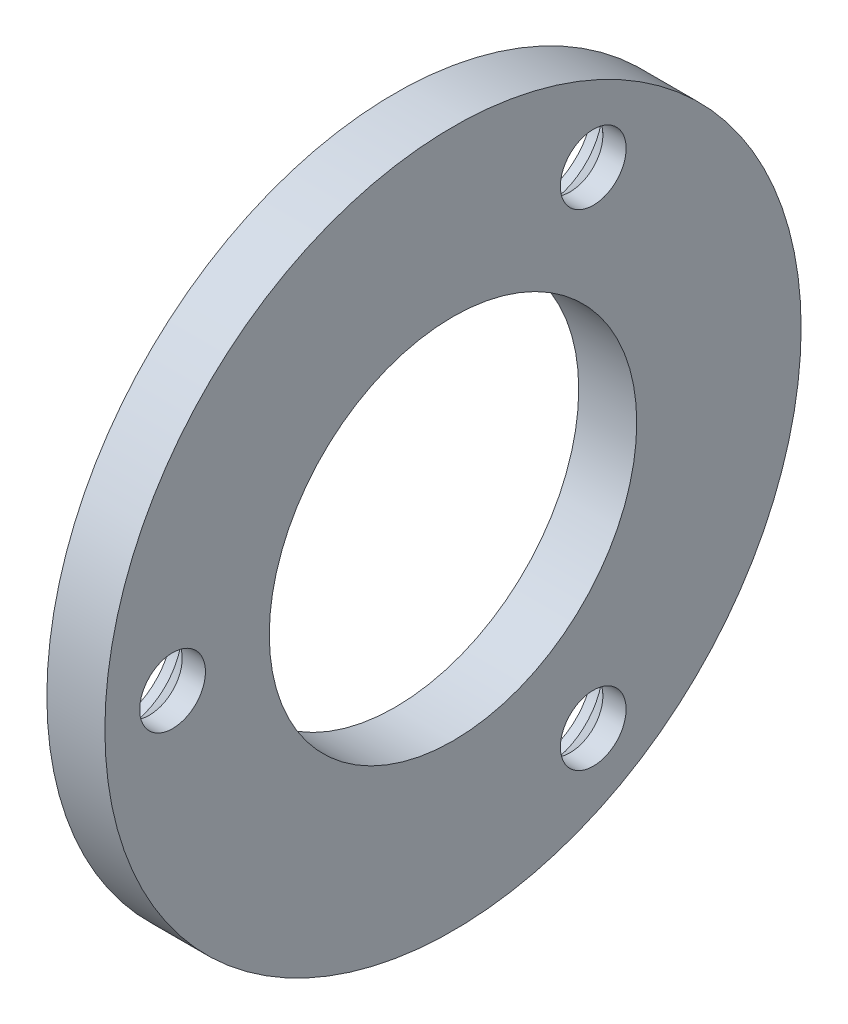
ISO-10303-21;
HEADER;
FILE_DESCRIPTION(('STEP AP214'),'2;1');
FILE_NAME('part.step','',(''),(''),'','','');
FILE_SCHEMA(('AUTOMOTIVE_DESIGN { 1 0 10303 214 1 1 1 1 }'));
ENDSEC;
DATA;
#1=APPLICATION_CONTEXT('core data for automotive mechanical design processes');
#2=APPLICATION_PROTOCOL_DEFINITION('international standard','automotive_design',2000,#1);
#3=PRODUCT_CONTEXT('',#1,'mechanical');
#4=PRODUCT('Part','Part','',(#3));
#5=PRODUCT_RELATED_PRODUCT_CATEGORY('part','',(#4));
#6=PRODUCT_DEFINITION_FORMATION('','',#4);
#7=PRODUCT_DEFINITION_CONTEXT('part definition',#1,'design');
#8=PRODUCT_DEFINITION('design','',#6,#7);
#9=PRODUCT_DEFINITION_SHAPE('','',#8);
#10=(LENGTH_UNIT() NAMED_UNIT(*) SI_UNIT(.MILLI.,.METRE.));
#11=(NAMED_UNIT(*) PLANE_ANGLE_UNIT() SI_UNIT($,.RADIAN.));
#12=(NAMED_UNIT(*) SI_UNIT($,.STERADIAN.) SOLID_ANGLE_UNIT());
#13=UNCERTAINTY_MEASURE_WITH_UNIT(LENGTH_MEASURE(1.E-05),#10,'distance_accuracy_value','');
#14=(GEOMETRIC_REPRESENTATION_CONTEXT(3) GLOBAL_UNCERTAINTY_ASSIGNED_CONTEXT((#13)) GLOBAL_UNIT_ASSIGNED_CONTEXT((#10,
#11,#12)) REPRESENTATION_CONTEXT('',''));
#15=CARTESIAN_POINT('',(0.,0.,0.));
#16=DIRECTION('',(0.,0.,1.));
#17=DIRECTION('',(1.,0.,0.));
#18=AXIS2_PLACEMENT_3D('',#15,#16,#17);
#19=CARTESIAN_POINT('',(43.2,93.157368354874,-7.25));
#20=DIRECTION('',(-1.,0.,0.));
#21=DIRECTION('',(0.,0.,1.));
#22=AXIS2_PLACEMENT_3D('',#19,#20,#21);
#23=CONICAL_SURFACE('',#22,3.,0.785398163397);
#24=CARTESIAN_POINT('',(44.5,93.157368354874,-7.25));
#25=DIRECTION('',(1.,0.,0.));
#26=DIRECTION('',(0.,0.,1.));
#27=AXIS2_PLACEMENT_3D('',#24,#25,#26);
#28=CIRCLE('',#27,1.7);
#29=CARTESIAN_POINT('',(44.5,93.157368354874,-8.95));
#30=VERTEX_POINT('',#29);
#31=CARTESIAN_POINT('',(44.5,93.157368354874,-5.55));
#32=VERTEX_POINT('',#31);
#33=EDGE_CURVE('E175',#30,#32,#28,.T.);
#34=ORIENTED_EDGE('',*,*,#33,.T.);
#35=DIRECTION('',(0.707106781186548,0.,-0.707106781186548));
#36=VECTOR('',#35,1.);
#37=CARTESIAN_POINT('',(43.2,93.157368354874,-4.25));
#38=LINE('',#37,#36);
#39=CARTESIAN_POINT('',(43.2,93.157368354874,-4.25));
#40=VERTEX_POINT('',#39);
#41=EDGE_CURVE('E9',#40,#32,#38,.T.);
#42=ORIENTED_EDGE('',*,*,#41,.F.);
#43=CARTESIAN_POINT('',(43.2,93.157368354874,-7.25));
#44=DIRECTION('',(1.,0.,0.));
#45=DIRECTION('',(0.,0.,-1.));
#46=AXIS2_PLACEMENT_3D('',#43,#44,#45);
#47=CIRCLE('',#46,3.);
#48=CARTESIAN_POINT('',(43.2,93.157368354874,-10.25));
#49=VERTEX_POINT('',#48);
#50=EDGE_CURVE('E144',#49,#40,#47,.T.);
#51=ORIENTED_EDGE('',*,*,#50,.F.);
#52=CARTESIAN_POINT('',(43.2,93.157368354874,-7.25));
#53=DIRECTION('',(1.,0.,0.));
#54=DIRECTION('',(0.,0.,-1.));
#55=AXIS2_PLACEMENT_3D('',#52,#53,#54);
#56=CIRCLE('',#55,3.);
#57=EDGE_CURVE('E142',#40,#49,#56,.T.);
#58=ORIENTED_EDGE('',*,*,#57,.F.);
#59=ORIENTED_EDGE('',*,*,#41,.T.);
#60=CARTESIAN_POINT('',(44.5,93.157368354874,-7.25));
#61=DIRECTION('',(1.,0.,0.));
#62=DIRECTION('',(0.,0.,1.));
#63=AXIS2_PLACEMENT_3D('',#60,#61,#62);
#64=CIRCLE('',#63,1.7);
#65=EDGE_CURVE('E179',#32,#30,#64,.T.);
#66=ORIENTED_EDGE('',*,*,#65,.T.);
#67=EDGE_LOOP('',(#34,#42,#51,#58,#59,#66));
#68=FACE_BOUND('',#67,.T.);
#69=ADVANCED_FACE('F14',(#68),#23,.F.);
#70=CARTESIAN_POINT('',(43.2,80.6,14.5));
#71=DIRECTION('',(-1.,0.,0.));
#72=DIRECTION('',(0.,0.,1.));
#73=AXIS2_PLACEMENT_3D('',#70,#71,#72);
#74=CONICAL_SURFACE('',#73,3.,0.785398163397);
#75=CARTESIAN_POINT('',(44.5,80.6,14.5));
#76=DIRECTION('',(1.,0.,0.));
#77=DIRECTION('',(0.,0.,1.));
#78=AXIS2_PLACEMENT_3D('',#75,#76,#77);
#79=CIRCLE('',#78,1.7);
#80=CARTESIAN_POINT('',(44.5,80.6,12.8));
#81=VERTEX_POINT('',#80);
#82=CARTESIAN_POINT('',(44.5,80.6,16.2));
#83=VERTEX_POINT('',#82);
#84=EDGE_CURVE('E180',#81,#83,#79,.T.);
#85=ORIENTED_EDGE('',*,*,#84,.T.);
#86=DIRECTION('',(0.707106781186548,0.,-0.707106781186548));
#87=VECTOR('',#86,1.);
#88=CARTESIAN_POINT('',(43.2,80.6,17.5));
#89=LINE('',#88,#87);
#90=CARTESIAN_POINT('',(43.2,80.6,17.5));
#91=VERTEX_POINT('',#90);
#92=EDGE_CURVE('E25',#91,#83,#89,.T.);
#93=ORIENTED_EDGE('',*,*,#92,.F.);
#94=CARTESIAN_POINT('',(43.2,80.6,14.5));
#95=DIRECTION('',(1.,0.,0.));
#96=DIRECTION('',(0.,0.,-1.));
#97=AXIS2_PLACEMENT_3D('',#94,#95,#96);
#98=CIRCLE('',#97,3.);
#99=CARTESIAN_POINT('',(43.2,80.6,11.5));
#100=VERTEX_POINT('',#99);
#101=EDGE_CURVE('E190',#100,#91,#98,.T.);
#102=ORIENTED_EDGE('',*,*,#101,.F.);
#103=CARTESIAN_POINT('',(43.2,80.6,14.5));
#104=DIRECTION('',(1.,0.,0.));
#105=DIRECTION('',(0.,0.,-1.));
#106=AXIS2_PLACEMENT_3D('',#103,#104,#105);
#107=CIRCLE('',#106,3.);
#108=EDGE_CURVE('E194',#91,#100,#107,.T.);
#109=ORIENTED_EDGE('',*,*,#108,.F.);
#110=ORIENTED_EDGE('',*,*,#92,.T.);
#111=CARTESIAN_POINT('',(44.5,80.6,14.5));
#112=DIRECTION('',(1.,0.,0.));
#113=DIRECTION('',(0.,0.,1.));
#114=AXIS2_PLACEMENT_3D('',#111,#112,#113);
#115=CIRCLE('',#114,1.7);
#116=EDGE_CURVE('E169',#83,#81,#115,.T.);
#117=ORIENTED_EDGE('',*,*,#116,.T.);
#118=EDGE_LOOP('',(#85,#93,#102,#109,#110,#117));
#119=FACE_BOUND('',#118,.T.);
#120=ADVANCED_FACE('F262',(#119),#74,.F.);
#121=CARTESIAN_POINT('',(43.2,68.042631645126,-7.25));
#122=DIRECTION('',(-1.,0.,0.));
#123=DIRECTION('',(0.,0.,1.));
#124=AXIS2_PLACEMENT_3D('',#121,#122,#123);
#125=CONICAL_SURFACE('',#124,3.,0.785398163397);
#126=CARTESIAN_POINT('',(44.5,68.042631645126,-7.25));
#127=DIRECTION('',(1.,0.,0.));
#128=DIRECTION('',(0.,0.,1.));
#129=AXIS2_PLACEMENT_3D('',#126,#127,#128);
#130=CIRCLE('',#129,1.7);
#131=CARTESIAN_POINT('',(44.5,68.042631645126,-8.95));
#132=VERTEX_POINT('',#131);
#133=CARTESIAN_POINT('',(44.5,68.042631645126,-5.55));
#134=VERTEX_POINT('',#133);
#135=EDGE_CURVE('E159',#132,#134,#130,.T.);
#136=ORIENTED_EDGE('',*,*,#135,.T.);
#137=DIRECTION('',(0.707106781186548,0.,-0.707106781186548));
#138=VECTOR('',#137,1.);
#139=CARTESIAN_POINT('',(43.2,68.042631645126,-4.25));
#140=LINE('',#139,#138);
#141=CARTESIAN_POINT('',(43.2,68.042631645126,-4.25));
#142=VERTEX_POINT('',#141);
#143=EDGE_CURVE('E170',#142,#134,#140,.T.);
#144=ORIENTED_EDGE('',*,*,#143,.F.);
#145=CARTESIAN_POINT('',(43.2,68.042631645126,-7.25));
#146=DIRECTION('',(1.,0.,0.));
#147=DIRECTION('',(0.,0.,-1.));
#148=AXIS2_PLACEMENT_3D('',#145,#146,#147);
#149=CIRCLE('',#148,3.);
#150=CARTESIAN_POINT('',(43.2,68.042631645126,-10.25));
#151=VERTEX_POINT('',#150);
#152=EDGE_CURVE('E196',#151,#142,#149,.T.);
#153=ORIENTED_EDGE('',*,*,#152,.F.);
#154=CARTESIAN_POINT('',(43.2,68.042631645126,-7.25));
#155=DIRECTION('',(1.,0.,0.));
#156=DIRECTION('',(0.,0.,-1.));
#157=AXIS2_PLACEMENT_3D('',#154,#155,#156);
#158=CIRCLE('',#157,3.);
#159=EDGE_CURVE('E145',#142,#151,#158,.T.);
#160=ORIENTED_EDGE('',*,*,#159,.F.);
#161=ORIENTED_EDGE('',*,*,#143,.T.);
#162=CARTESIAN_POINT('',(44.5,68.042631645126,-7.25));
#163=DIRECTION('',(1.,0.,0.));
#164=DIRECTION('',(0.,0.,1.));
#165=AXIS2_PLACEMENT_3D('',#162,#163,#164);
#166=CIRCLE('',#165,1.7);
#167=EDGE_CURVE('E151',#134,#132,#166,.T.);
#168=ORIENTED_EDGE('',*,*,#167,.T.);
#169=EDGE_LOOP('',(#136,#144,#153,#160,#161,#168));
#170=FACE_BOUND('',#169,.T.);
#171=ADVANCED_FACE('F267',(#170),#125,.F.);
#172=CARTESIAN_POINT('',(42.6,93.157368354874,-7.25));
#173=DIRECTION('',(1.,0.,0.));
#174=DIRECTION('',(0.,0.,-1.));
#175=AXIS2_PLACEMENT_3D('',#172,#173,#174);
#176=CYLINDRICAL_SURFACE('',#175,3.);
#177=DIRECTION('',(1.,0.,0.));
#178=VECTOR('',#177,1.);
#179=CARTESIAN_POINT('',(42.6,93.157368354874,-10.25));
#180=LINE('',#179,#178);
#181=CARTESIAN_POINT('',(42.7,93.157368354874,-10.25));
#182=VERTEX_POINT('',#181);
#183=EDGE_CURVE('E137',#182,#49,#180,.T.);
#184=ORIENTED_EDGE('',*,*,#183,.T.);
#185=ORIENTED_EDGE('',*,*,#50,.T.);
#186=ORIENTED_EDGE('',*,*,#57,.T.);
#187=ORIENTED_EDGE('',*,*,#183,.F.);
#188=CARTESIAN_POINT('',(42.7,93.157368354874,-7.25));
#189=DIRECTION('',(1.,0.,0.));
#190=DIRECTION('',(0.,0.,-1.));
#191=AXIS2_PLACEMENT_3D('',#188,#189,#190);
#192=CIRCLE('',#191,3.);
#193=EDGE_CURVE('E140',#182,#182,#192,.T.);
#194=ORIENTED_EDGE('',*,*,#193,.F.);
#195=EDGE_LOOP('',(#184,#185,#186,#187,#194));
#196=FACE_BOUND('',#195,.T.);
#197=ADVANCED_FACE('F139',(#196),#176,.F.);
#198=CARTESIAN_POINT('',(42.6,68.042631645126,-7.25));
#199=DIRECTION('',(1.,0.,0.));
#200=DIRECTION('',(0.,0.,-1.));
#201=AXIS2_PLACEMENT_3D('',#198,#199,#200);
#202=CYLINDRICAL_SURFACE('',#201,3.);
#203=DIRECTION('',(1.,0.,0.));
#204=VECTOR('',#203,1.);
#205=CARTESIAN_POINT('',(42.6,68.042631645126,-10.25));
#206=LINE('',#205,#204);
#207=CARTESIAN_POINT('',(42.7,68.042631645126,-10.25));
#208=VERTEX_POINT('',#207);
#209=EDGE_CURVE('E200',#208,#151,#206,.T.);
#210=ORIENTED_EDGE('',*,*,#209,.T.);
#211=ORIENTED_EDGE('',*,*,#152,.T.);
#212=ORIENTED_EDGE('',*,*,#159,.T.);
#213=ORIENTED_EDGE('',*,*,#209,.F.);
#214=CARTESIAN_POINT('',(42.7,68.042631645126,-7.25));
#215=DIRECTION('',(1.,0.,0.));
#216=DIRECTION('',(0.,0.,-1.));
#217=AXIS2_PLACEMENT_3D('',#214,#215,#216);
#218=CIRCLE('',#217,3.);
#219=EDGE_CURVE('E163',#208,#208,#218,.T.);
#220=ORIENTED_EDGE('',*,*,#219,.F.);
#221=EDGE_LOOP('',(#210,#211,#212,#213,#220));
#222=FACE_BOUND('',#221,.T.);
#223=ADVANCED_FACE('F16',(#222),#202,.F.);
#224=CARTESIAN_POINT('',(42.6,80.6,14.5));
#225=DIRECTION('',(1.,0.,0.));
#226=DIRECTION('',(0.,0.,-1.));
#227=AXIS2_PLACEMENT_3D('',#224,#225,#226);
#228=CYLINDRICAL_SURFACE('',#227,3.);
#229=DIRECTION('',(1.,0.,0.));
#230=VECTOR('',#229,1.);
#231=CARTESIAN_POINT('',(42.6,80.6,11.5));
#232=LINE('',#231,#230);
#233=CARTESIAN_POINT('',(42.7,80.6,11.5));
#234=VERTEX_POINT('',#233);
#235=EDGE_CURVE('E195',#234,#100,#232,.T.);
#236=ORIENTED_EDGE('',*,*,#235,.T.);
#237=ORIENTED_EDGE('',*,*,#101,.T.);
#238=ORIENTED_EDGE('',*,*,#108,.T.);
#239=ORIENTED_EDGE('',*,*,#235,.F.);
#240=CARTESIAN_POINT('',(42.7,80.6,14.5));
#241=DIRECTION('',(1.,0.,0.));
#242=DIRECTION('',(0.,0.,-1.));
#243=AXIS2_PLACEMENT_3D('',#240,#241,#242);
#244=CIRCLE('',#243,3.);
#245=EDGE_CURVE('E187',#234,#234,#244,.T.);
#246=ORIENTED_EDGE('',*,*,#245,.F.);
#247=EDGE_LOOP('',(#236,#237,#238,#239,#246));
#248=FACE_BOUND('',#247,.T.);
#249=ADVANCED_FACE('F277',(#248),#228,.F.);
#250=CARTESIAN_POINT('',(42.6,93.157368354874,-7.25));
#251=DIRECTION('',(1.,0.,0.));
#252=DIRECTION('',(0.,0.,-1.));
#253=AXIS2_PLACEMENT_3D('',#250,#251,#252);
#254=CYLINDRICAL_SURFACE('',#253,1.7);
#255=ORIENTED_EDGE('',*,*,#65,.F.);
#256=ORIENTED_EDGE('',*,*,#33,.F.);
#257=DIRECTION('',(1.,0.,0.));
#258=VECTOR('',#257,1.);
#259=CARTESIAN_POINT('',(42.6,93.157368354874,-8.95));
#260=LINE('',#259,#258);
#261=CARTESIAN_POINT('',(45.7,93.157368354874,-8.95));
#262=VERTEX_POINT('',#261);
#263=EDGE_CURVE('E178',#30,#262,#260,.T.);
#264=ORIENTED_EDGE('',*,*,#263,.T.);
#265=CARTESIAN_POINT('',(45.7,93.157368354874,-7.25));
#266=DIRECTION('',(1.,0.,0.));
#267=DIRECTION('',(0.,0.,-1.));
#268=AXIS2_PLACEMENT_3D('',#265,#266,#267);
#269=CIRCLE('',#268,1.7);
#270=EDGE_CURVE('E213',#262,#262,#269,.T.);
#271=ORIENTED_EDGE('',*,*,#270,.T.);
#272=ORIENTED_EDGE('',*,*,#263,.F.);
#273=EDGE_LOOP('',(#255,#256,#264,#271,#272));
#274=FACE_BOUND('',#273,.T.);
#275=ADVANCED_FACE('F283',(#274),#254,.F.);
#276=CARTESIAN_POINT('',(41.7,80.6,0.));
#277=DIRECTION('',(1.,0.,0.));
#278=DIRECTION('',(0.,0.,-1.));
#279=AXIS2_PLACEMENT_3D('',#276,#277,#278);
#280=CYLINDRICAL_SURFACE('',#279,9.5);
#281=DIRECTION('',(1.,0.,0.));
#282=VECTOR('',#281,1.);
#283=CARTESIAN_POINT('',(41.7,80.6,-9.5));
#284=LINE('',#283,#282);
#285=CARTESIAN_POINT('',(42.7,80.6,-9.5));
#286=VERTEX_POINT('',#285);
#287=CARTESIAN_POINT('',(45.7,80.6,-9.5));
#288=VERTEX_POINT('',#287);
#289=EDGE_CURVE('E202',#286,#288,#284,.T.);
#290=ORIENTED_EDGE('',*,*,#289,.F.);
#291=CARTESIAN_POINT('',(42.7,80.6,0.));
#292=DIRECTION('',(1.,0.,0.));
#293=DIRECTION('',(0.,0.,-1.));
#294=AXIS2_PLACEMENT_3D('',#291,#292,#293);
#295=CIRCLE('',#294,9.5);
#296=EDGE_CURVE('E152',#286,#286,#295,.T.);
#297=ORIENTED_EDGE('',*,*,#296,.F.);
#298=ORIENTED_EDGE('',*,*,#289,.T.);
#299=CARTESIAN_POINT('',(45.7,80.6,0.));
#300=DIRECTION('',(1.,0.,0.));
#301=DIRECTION('',(0.,0.,-1.));
#302=AXIS2_PLACEMENT_3D('',#299,#300,#301);
#303=CIRCLE('',#302,9.5);
#304=EDGE_CURVE('E221',#288,#288,#303,.T.);
#305=ORIENTED_EDGE('',*,*,#304,.T.);
#306=EDGE_LOOP('',(#290,#297,#298,#305));
#307=FACE_BOUND('',#306,.T.);
#308=ADVANCED_FACE('F270',(#307),#280,.F.);
#309=CARTESIAN_POINT('',(42.6,80.6,14.5));
#310=DIRECTION('',(1.,0.,0.));
#311=DIRECTION('',(0.,0.,-1.));
#312=AXIS2_PLACEMENT_3D('',#309,#310,#311);
#313=CYLINDRICAL_SURFACE('',#312,1.7);
#314=ORIENTED_EDGE('',*,*,#116,.F.);
#315=ORIENTED_EDGE('',*,*,#84,.F.);
#316=DIRECTION('',(1.,0.,0.));
#317=VECTOR('',#316,1.);
#318=CARTESIAN_POINT('',(42.6,80.6,12.8));
#319=LINE('',#318,#317);
#320=CARTESIAN_POINT('',(45.7,80.6,12.8));
#321=VERTEX_POINT('',#320);
#322=EDGE_CURVE('E183',#81,#321,#319,.T.);
#323=ORIENTED_EDGE('',*,*,#322,.T.);
#324=CARTESIAN_POINT('',(45.7,80.6,14.5));
#325=DIRECTION('',(1.,0.,0.));
#326=DIRECTION('',(0.,0.,-1.));
#327=AXIS2_PLACEMENT_3D('',#324,#325,#326);
#328=CIRCLE('',#327,1.7);
#329=EDGE_CURVE('E225',#321,#321,#328,.T.);
#330=ORIENTED_EDGE('',*,*,#329,.T.);
#331=ORIENTED_EDGE('',*,*,#322,.F.);
#332=EDGE_LOOP('',(#314,#315,#323,#330,#331));
#333=FACE_BOUND('',#332,.T.);
#334=ADVANCED_FACE('F301',(#333),#313,.F.);
#335=CARTESIAN_POINT('',(42.6,68.042631645126,-7.25));
#336=DIRECTION('',(1.,0.,0.));
#337=DIRECTION('',(0.,0.,-1.));
#338=AXIS2_PLACEMENT_3D('',#335,#336,#337);
#339=CYLINDRICAL_SURFACE('',#338,1.7);
#340=ORIENTED_EDGE('',*,*,#167,.F.);
#341=ORIENTED_EDGE('',*,*,#135,.F.);
#342=DIRECTION('',(1.,0.,0.));
#343=VECTOR('',#342,1.);
#344=CARTESIAN_POINT('',(42.6,68.042631645126,-8.95));
#345=LINE('',#344,#343);
#346=CARTESIAN_POINT('',(45.7,68.042631645126,-8.95));
#347=VERTEX_POINT('',#346);
#348=EDGE_CURVE('E80',#132,#347,#345,.T.);
#349=ORIENTED_EDGE('',*,*,#348,.T.);
#350=CARTESIAN_POINT('',(45.7,68.042631645126,-7.25));
#351=DIRECTION('',(1.,0.,0.));
#352=DIRECTION('',(0.,0.,-1.));
#353=AXIS2_PLACEMENT_3D('',#350,#351,#352);
#354=CIRCLE('',#353,1.7);
#355=EDGE_CURVE('E237',#347,#347,#354,.T.);
#356=ORIENTED_EDGE('',*,*,#355,.T.);
#357=ORIENTED_EDGE('',*,*,#348,.F.);
#358=EDGE_LOOP('',(#340,#341,#349,#356,#357));
#359=FACE_BOUND('',#358,.T.);
#360=ADVANCED_FACE('F296',(#359),#339,.F.);
#361=CARTESIAN_POINT('',(42.7,80.6,0.));
#362=DIRECTION('',(1.,0.,0.));
#363=DIRECTION('',(0.,0.,1.));
#364=AXIS2_PLACEMENT_3D('',#361,#362,#363);
#365=PLANE('',#364);
#366=ORIENTED_EDGE('',*,*,#193,.T.);
#367=EDGE_LOOP('',(#366));
#368=FACE_BOUND('',#367,.T.);
#369=ORIENTED_EDGE('',*,*,#296,.T.);
#370=EDGE_LOOP('',(#369));
#371=FACE_BOUND('',#370,.T.);
#372=ORIENTED_EDGE('',*,*,#219,.T.);
#373=EDGE_LOOP('',(#372));
#374=FACE_BOUND('',#373,.T.);
#375=ORIENTED_EDGE('',*,*,#245,.T.);
#376=EDGE_LOOP('',(#375));
#377=FACE_BOUND('',#376,.T.);
#378=CARTESIAN_POINT('',(42.7,80.6,0.));
#379=DIRECTION('',(1.,0.,0.));
#380=DIRECTION('',(0.,0.,-1.));
#381=AXIS2_PLACEMENT_3D('',#378,#379,#380);
#382=CIRCLE('',#381,18.);
#383=CARTESIAN_POINT('',(42.7,80.6,-18.));
#384=VERTEX_POINT('',#383);
#385=EDGE_CURVE('E111',#384,#384,#382,.T.);
#386=ORIENTED_EDGE('',*,*,#385,.F.);
#387=EDGE_LOOP('',(#386));
#388=FACE_BOUND('',#387,.T.);
#389=ADVANCED_FACE('F148',(#368,#371,#374,#377,#388),#365,.F.);
#390=CARTESIAN_POINT('',(45.7,80.6,0.));
#391=DIRECTION('',(1.,0.,0.));
#392=DIRECTION('',(0.,0.,1.));
#393=AXIS2_PLACEMENT_3D('',#390,#391,#392);
#394=PLANE('',#393);
#395=ORIENTED_EDGE('',*,*,#270,.F.);
#396=EDGE_LOOP('',(#395));
#397=FACE_BOUND('',#396,.T.);
#398=ORIENTED_EDGE('',*,*,#304,.F.);
#399=EDGE_LOOP('',(#398));
#400=FACE_BOUND('',#399,.T.);
#401=ORIENTED_EDGE('',*,*,#329,.F.);
#402=EDGE_LOOP('',(#401));
#403=FACE_BOUND('',#402,.T.);
#404=ORIENTED_EDGE('',*,*,#355,.F.);
#405=EDGE_LOOP('',(#404));
#406=FACE_BOUND('',#405,.T.);
#407=CARTESIAN_POINT('',(45.7,80.6,0.));
#408=DIRECTION('',(1.,0.,0.));
#409=DIRECTION('',(0.,0.,-1.));
#410=AXIS2_PLACEMENT_3D('',#407,#408,#409);
#411=CIRCLE('',#410,18.);
#412=CARTESIAN_POINT('',(45.7,80.6,-18.));
#413=VERTEX_POINT('',#412);
#414=EDGE_CURVE('E18',#413,#413,#411,.T.);
#415=ORIENTED_EDGE('',*,*,#414,.T.);
#416=EDGE_LOOP('',(#415));
#417=FACE_BOUND('',#416,.T.);
#418=ADVANCED_FACE('F250',(#397,#400,#403,#406,#417),#394,.T.);
#419=CARTESIAN_POINT('',(42.7,80.6,0.));
#420=DIRECTION('',(1.,0.,0.));
#421=DIRECTION('',(0.,0.,-1.));
#422=AXIS2_PLACEMENT_3D('',#419,#420,#421);
#423=CYLINDRICAL_SURFACE('',#422,18.);
#424=ORIENTED_EDGE('',*,*,#414,.F.);
#425=DIRECTION('',(1.,0.,0.));
#426=VECTOR('',#425,1.);
#427=CARTESIAN_POINT('',(42.7,80.6,-18.));
#428=LINE('',#427,#426);
#429=EDGE_CURVE('E118',#384,#413,#428,.T.);
#430=ORIENTED_EDGE('',*,*,#429,.F.);
#431=ORIENTED_EDGE('',*,*,#385,.T.);
#432=ORIENTED_EDGE('',*,*,#429,.T.);
#433=EDGE_LOOP('',(#424,#430,#431,#432));
#434=FACE_BOUND('',#433,.T.);
#435=ADVANCED_FACE('F251',(#434),#423,.T.);
#436=CLOSED_SHELL('',(#69,#120,#171,#197,#223,#249,#275,#308,#334,#360,#389,#418,#435));
#437=MANIFOLD_SOLID_BREP('B1',#436);
#438=ADVANCED_BREP_SHAPE_REPRESENTATION('',(#18,#437),#14);
#439=SHAPE_DEFINITION_REPRESENTATION(#9,#438);
ENDSEC;
END-ISO-10303-21;
